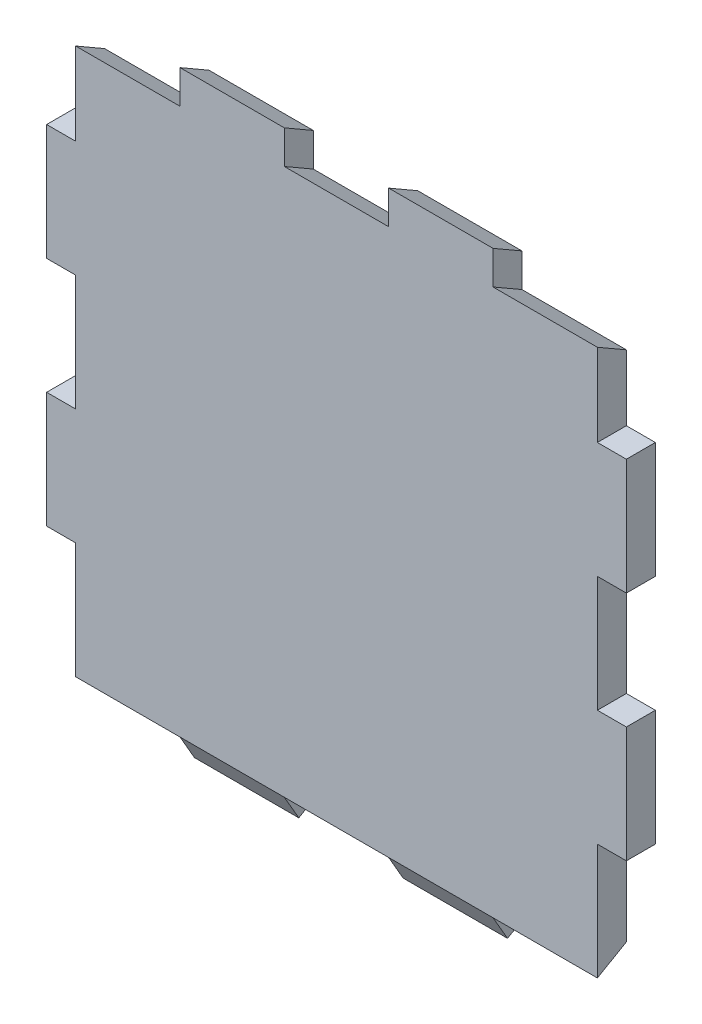
ISO-10303-21;
HEADER;
FILE_DESCRIPTION(('STEP AP214'),'2;1');
FILE_NAME('part.step','',(''),(''),'','','');
FILE_SCHEMA(('AUTOMOTIVE_DESIGN { 1 0 10303 214 1 1 1 1 }'));
ENDSEC;
DATA;
#1=APPLICATION_CONTEXT('core data for automotive mechanical design processes');
#2=APPLICATION_PROTOCOL_DEFINITION('international standard','automotive_design',2000,#1);
#3=PRODUCT_CONTEXT('',#1,'mechanical');
#4=PRODUCT('Part','Part','',(#3));
#5=PRODUCT_RELATED_PRODUCT_CATEGORY('part','',(#4));
#6=PRODUCT_DEFINITION_FORMATION('','',#4);
#7=PRODUCT_DEFINITION_CONTEXT('part definition',#1,'design');
#8=PRODUCT_DEFINITION('design','',#6,#7);
#9=PRODUCT_DEFINITION_SHAPE('','',#8);
#10=(LENGTH_UNIT() NAMED_UNIT(*) SI_UNIT(.MILLI.,.METRE.));
#11=(NAMED_UNIT(*) PLANE_ANGLE_UNIT() SI_UNIT($,.RADIAN.));
#12=(NAMED_UNIT(*) SI_UNIT($,.STERADIAN.) SOLID_ANGLE_UNIT());
#13=UNCERTAINTY_MEASURE_WITH_UNIT(LENGTH_MEASURE(1.E-05),#10,'distance_accuracy_value','');
#14=(GEOMETRIC_REPRESENTATION_CONTEXT(3) GLOBAL_UNCERTAINTY_ASSIGNED_CONTEXT((#13)) GLOBAL_UNIT_ASSIGNED_CONTEXT((#10,
#11,#12)) REPRESENTATION_CONTEXT('',''));
#15=CARTESIAN_POINT('',(0.,0.,0.));
#16=DIRECTION('',(0.,0.,1.));
#17=DIRECTION('',(1.,0.,0.));
#18=AXIS2_PLACEMENT_3D('',#15,#16,#17);
#19=CARTESIAN_POINT('',(-90.,0.,5.));
#20=DIRECTION('',(1.,0.,0.));
#21=DIRECTION('',(0.,0.,-1.));
#22=AXIS2_PLACEMENT_3D('',#19,#20,#21);
#23=PLANE('',#22);
#24=DIRECTION('',(0.,-1.,0.));
#25=VECTOR('',#24,1.);
#26=CARTESIAN_POINT('',(-90.,0.,0.));
#27=LINE('',#26,#25);
#28=CARTESIAN_POINT('',(-90.,-11.5470053838162,0.));
#29=VERTEX_POINT('',#28);
#30=CARTESIAN_POINT('',(-90.,-22.8867513459481,0.));
#31=VERTEX_POINT('',#30);
#32=EDGE_CURVE('E492',#29,#31,#27,.T.);
#33=ORIENTED_EDGE('',*,*,#32,.T.);
#34=DIRECTION('',(0.,0.,1.));
#35=VECTOR('',#34,1.);
#36=CARTESIAN_POINT('',(-90.,-22.8867513459481,0.));
#37=LINE('',#36,#35);
#38=CARTESIAN_POINT('',(-90.,-22.8867513459481,5.));
#39=VERTEX_POINT('',#38);
#40=EDGE_CURVE('E290',#31,#39,#37,.T.);
#41=ORIENTED_EDGE('',*,*,#40,.T.);
#42=DIRECTION('',(0.,-1.,0.));
#43=VECTOR('',#42,1.);
#44=CARTESIAN_POINT('',(-90.,0.,5.));
#45=LINE('',#44,#43);
#46=CARTESIAN_POINT('',(-90.,-8.66025403786807,5.00000000000001));
#47=VERTEX_POINT('',#46);
#48=EDGE_CURVE('E483',#47,#39,#45,.T.);
#49=ORIENTED_EDGE('',*,*,#48,.F.);
#50=DIRECTION('',(0.,-0.500000000000001,-0.866025403784438));
#51=VECTOR('',#50,1.);
#52=CARTESIAN_POINT('',(-90.,-11.5470053838162,0.));
#53=LINE('',#52,#51);
#54=EDGE_CURVE('E461',#47,#29,#53,.T.);
#55=ORIENTED_EDGE('',*,*,#54,.T.);
#56=EDGE_LOOP('',(#33,#41,#49,#55));
#57=FACE_BOUND('',#56,.T.);
#58=ADVANCED_FACE('F33',(#57),#23,.F.);
#59=DIRECTION('',(0.,0.,1.));
#60=VECTOR('',#59,1.);
#61=CARTESIAN_POINT('',(-90.,-82.886751345948,0.));
#62=LINE('',#61,#60);
#63=CARTESIAN_POINT('',(-90.,-82.886751345948,0.));
#64=VERTEX_POINT('',#63);
#65=CARTESIAN_POINT('',(-90.,-82.886751345948,5.));
#66=VERTEX_POINT('',#65);
#67=EDGE_CURVE('E323',#64,#66,#62,.T.);
#68=ORIENTED_EDGE('',*,*,#67,.F.);
#69=CARTESIAN_POINT('',(-90.,-100.,0.));
#70=VERTEX_POINT('',#69);
#71=EDGE_CURVE('E490',#64,#70,#27,.T.);
#72=ORIENTED_EDGE('',*,*,#71,.T.);
#73=DIRECTION('',(0.,0.500000000000007,-0.866025403784435));
#74=VECTOR('',#73,1.);
#75=CARTESIAN_POINT('',(-90.,-102.886751345948,4.99999999999983));
#76=LINE('',#75,#74);
#77=CARTESIAN_POINT('',(-90.,-102.886751345948,4.99999999999983));
#78=VERTEX_POINT('',#77);
#79=EDGE_CURVE('E450',#78,#70,#76,.T.);
#80=ORIENTED_EDGE('',*,*,#79,.F.);
#81=EDGE_CURVE('E480',#66,#78,#45,.T.);
#82=ORIENTED_EDGE('',*,*,#81,.F.);
#83=EDGE_LOOP('',(#68,#72,#80,#82));
#84=FACE_BOUND('',#83,.T.);
#85=ADVANCED_FACE('F545',(#84),#23,.F.);
#86=CARTESIAN_POINT('',(0.,0.,5.));
#87=DIRECTION('',(-1.,0.,0.));
#88=DIRECTION('',(0.,0.,1.));
#89=AXIS2_PLACEMENT_3D('',#86,#87,#88);
#90=PLANE('',#89);
#91=DIRECTION('',(0.,1.,0.));
#92=VECTOR('',#91,1.);
#93=CARTESIAN_POINT('',(0.,0.,5.));
#94=LINE('',#93,#92);
#95=CARTESIAN_POINT('',(0.,-62.886751345948,5.));
#96=VERTEX_POINT('',#95);
#97=CARTESIAN_POINT('',(0.,-42.886751345948,5.));
#98=VERTEX_POINT('',#97);
#99=EDGE_CURVE('E481',#96,#98,#94,.T.);
#100=ORIENTED_EDGE('',*,*,#99,.F.);
#101=DIRECTION('',(0.,0.,1.));
#102=VECTOR('',#101,1.);
#103=CARTESIAN_POINT('',(0.,-62.886751345948,0.));
#104=LINE('',#103,#102);
#105=CARTESIAN_POINT('',(0.,-62.886751345948,0.));
#106=VERTEX_POINT('',#105);
#107=EDGE_CURVE('E344',#106,#96,#104,.T.);
#108=ORIENTED_EDGE('',*,*,#107,.F.);
#109=DIRECTION('',(0.,1.,0.));
#110=VECTOR('',#109,1.);
#111=CARTESIAN_POINT('',(0.,0.,0.));
#112=LINE('',#111,#110);
#113=CARTESIAN_POINT('',(0.,-42.886751345948,0.));
#114=VERTEX_POINT('',#113);
#115=EDGE_CURVE('E491',#106,#114,#112,.T.);
#116=ORIENTED_EDGE('',*,*,#115,.T.);
#117=DIRECTION('',(0.,0.,1.));
#118=VECTOR('',#117,1.);
#119=CARTESIAN_POINT('',(0.,-42.886751345948,0.));
#120=LINE('',#119,#118);
#121=EDGE_CURVE('E363',#114,#98,#120,.T.);
#122=ORIENTED_EDGE('',*,*,#121,.T.);
#123=EDGE_LOOP('',(#100,#108,#116,#122));
#124=FACE_BOUND('',#123,.T.);
#125=ADVANCED_FACE('F579',(#124),#90,.F.);
#126=DIRECTION('',(0.,0.,1.));
#127=VECTOR('',#126,1.);
#128=CARTESIAN_POINT('',(0.,-22.886751345948,0.));
#129=LINE('',#128,#127);
#130=CARTESIAN_POINT('',(0.,-22.886751345948,0.));
#131=VERTEX_POINT('',#130);
#132=CARTESIAN_POINT('',(0.,-22.886751345948,5.));
#133=VERTEX_POINT('',#132);
#134=EDGE_CURVE('E371',#131,#133,#129,.T.);
#135=ORIENTED_EDGE('',*,*,#134,.F.);
#136=CARTESIAN_POINT('',(0.,-11.5470053838162,0.));
#137=VERTEX_POINT('',#136);
#138=EDGE_CURVE('E470',#131,#137,#112,.T.);
#139=ORIENTED_EDGE('',*,*,#138,.T.);
#140=DIRECTION('',(0.,-0.500000000000001,-0.866025403784438));
#141=VECTOR('',#140,1.);
#142=CARTESIAN_POINT('',(0.,-11.5470053838162,0.));
#143=LINE('',#142,#141);
#144=CARTESIAN_POINT('',(0.,-8.66025403786807,5.00000000000001));
#145=VERTEX_POINT('',#144);
#146=EDGE_CURVE('E459',#145,#137,#143,.T.);
#147=ORIENTED_EDGE('',*,*,#146,.F.);
#148=EDGE_CURVE('E482',#133,#145,#94,.T.);
#149=ORIENTED_EDGE('',*,*,#148,.F.);
#150=EDGE_LOOP('',(#135,#139,#147,#149));
#151=FACE_BOUND('',#150,.T.);
#152=ADVANCED_FACE('F593',(#151),#90,.F.);
#153=CARTESIAN_POINT('',(0.,0.,5.));
#154=DIRECTION('',(0.,0.,-1.));
#155=DIRECTION('',(-1.,0.,0.));
#156=AXIS2_PLACEMENT_3D('',#153,#154,#155);
#157=PLANE('',#156);
#158=DIRECTION('',(1.,0.,0.));
#159=VECTOR('',#158,1.);
#160=CARTESIAN_POINT('',(-90.0000000000001,-102.886751345948,5.));
#161=LINE('',#160,#159);
#162=CARTESIAN_POINT('',(-36.,-102.886751345948,4.99999999999983));
#163=VERTEX_POINT('',#162);
#164=CARTESIAN_POINT('',(-18.,-102.886751345948,5.));
#165=VERTEX_POINT('',#164);
#166=EDGE_CURVE('E390',#163,#165,#161,.T.);
#167=ORIENTED_EDGE('',*,*,#166,.T.);
#168=DIRECTION('',(1.,0.,0.));
#169=VECTOR('',#168,1.);
#170=CARTESIAN_POINT('',(-90.,-102.886751345948,4.99999999999983));
#171=LINE('',#170,#169);
#172=CARTESIAN_POINT('',(0.,-102.886751345948,4.99999999999983));
#173=VERTEX_POINT('',#172);
#174=EDGE_CURVE('E453',#165,#173,#171,.T.);
#175=ORIENTED_EDGE('',*,*,#174,.T.);
#176=CARTESIAN_POINT('',(0.,-82.886751345948,5.));
#177=VERTEX_POINT('',#176);
#178=EDGE_CURVE('E477',#173,#177,#94,.T.);
#179=ORIENTED_EDGE('',*,*,#178,.T.);
#180=DIRECTION('',(1.,0.,0.));
#181=VECTOR('',#180,1.);
#182=CARTESIAN_POINT('',(0.,-82.886751345948,5.));
#183=LINE('',#182,#181);
#184=CARTESIAN_POINT('',(5.,-82.886751345948,5.));
#185=VERTEX_POINT('',#184);
#186=EDGE_CURVE('E322',#177,#185,#183,.T.);
#187=ORIENTED_EDGE('',*,*,#186,.T.);
#188=DIRECTION('',(0.,1.,0.));
#189=VECTOR('',#188,1.);
#190=CARTESIAN_POINT('',(5.,-62.886751345948,5.));
#191=LINE('',#190,#189);
#192=CARTESIAN_POINT('',(5.,-62.886751345948,5.));
#193=VERTEX_POINT('',#192);
#194=EDGE_CURVE('E340',#185,#193,#191,.T.);
#195=ORIENTED_EDGE('',*,*,#194,.T.);
#196=DIRECTION('',(-1.,0.,0.));
#197=VECTOR('',#196,1.);
#198=CARTESIAN_POINT('',(0.,-62.886751345948,5.));
#199=LINE('',#198,#197);
#200=EDGE_CURVE('E332',#193,#96,#199,.T.);
#201=ORIENTED_EDGE('',*,*,#200,.T.);
#202=ORIENTED_EDGE('',*,*,#99,.T.);
#203=DIRECTION('',(1.,0.,0.));
#204=VECTOR('',#203,1.);
#205=CARTESIAN_POINT('',(0.,-42.886751345948,5.));
#206=LINE('',#205,#204);
#207=CARTESIAN_POINT('',(5.,-42.886751345948,5.));
#208=VERTEX_POINT('',#207);
#209=EDGE_CURVE('E347',#98,#208,#206,.T.);
#210=ORIENTED_EDGE('',*,*,#209,.T.);
#211=DIRECTION('',(0.,1.,0.));
#212=VECTOR('',#211,1.);
#213=CARTESIAN_POINT('',(5.,-22.8867513459481,5.));
#214=LINE('',#213,#212);
#215=CARTESIAN_POINT('',(5.,-22.8867513459481,5.));
#216=VERTEX_POINT('',#215);
#217=EDGE_CURVE('E366',#208,#216,#214,.T.);
#218=ORIENTED_EDGE('',*,*,#217,.T.);
#219=DIRECTION('',(-1.,0.,0.));
#220=VECTOR('',#219,1.);
#221=CARTESIAN_POINT('',(0.,-22.886751345948,5.));
#222=LINE('',#221,#220);
#223=EDGE_CURVE('E358',#216,#133,#222,.T.);
#224=ORIENTED_EDGE('',*,*,#223,.T.);
#225=ORIENTED_EDGE('',*,*,#148,.T.);
#226=DIRECTION('',(1.,0.,0.));
#227=VECTOR('',#226,1.);
#228=CARTESIAN_POINT('',(-90.,-8.66025403786807,5.00000000000001));
#229=LINE('',#228,#227);
#230=CARTESIAN_POINT('',(-18.,-8.66025403786807,5.00000000000001));
#231=VERTEX_POINT('',#230);
#232=EDGE_CURVE('E464',#231,#145,#229,.T.);
#233=ORIENTED_EDGE('',*,*,#232,.F.);
#234=DIRECTION('',(0.,-1.,0.));
#235=VECTOR('',#234,1.);
#236=CARTESIAN_POINT('',(-18.,3.4529946161838,5.00000000000001));
#237=LINE('',#236,#235);
#238=CARTESIAN_POINT('',(-18.,-2.88675134594796,5.00000000000001));
#239=VERTEX_POINT('',#238);
#240=EDGE_CURVE('E440',#239,#231,#237,.T.);
#241=ORIENTED_EDGE('',*,*,#240,.F.);
#242=DIRECTION('',(1.,0.,0.));
#243=VECTOR('',#242,1.);
#244=CARTESIAN_POINT('',(-90.,-2.88675134594796,5.00000000000001));
#245=LINE('',#244,#243);
#246=CARTESIAN_POINT('',(-36.,-2.88675134594796,5.00000000000001));
#247=VERTEX_POINT('',#246);
#248=EDGE_CURVE('E418',#247,#239,#245,.T.);
#249=ORIENTED_EDGE('',*,*,#248,.F.);
#250=DIRECTION('',(0.,1.,0.));
#251=VECTOR('',#250,1.);
#252=CARTESIAN_POINT('',(-36.,3.45299461618379,5.00000000000001));
#253=LINE('',#252,#251);
#254=CARTESIAN_POINT('',(-36.,-8.66025403786807,5.00000000000001));
#255=VERTEX_POINT('',#254);
#256=EDGE_CURVE('E442',#255,#247,#253,.T.);
#257=ORIENTED_EDGE('',*,*,#256,.F.);
#258=CARTESIAN_POINT('',(-54.,-8.66025403786807,5.00000000000001));
#259=VERTEX_POINT('',#258);
#260=EDGE_CURVE('E476',#259,#255,#229,.T.);
#261=ORIENTED_EDGE('',*,*,#260,.F.);
#262=DIRECTION('',(0.,-1.,0.));
#263=VECTOR('',#262,1.);
#264=CARTESIAN_POINT('',(-54.,3.4529946161838,5.00000000000001));
#265=LINE('',#264,#263);
#266=CARTESIAN_POINT('',(-54.,-2.88675134594796,5.00000000000001));
#267=VERTEX_POINT('',#266);
#268=EDGE_CURVE('E430',#267,#259,#265,.T.);
#269=ORIENTED_EDGE('',*,*,#268,.F.);
#270=CARTESIAN_POINT('',(-72.,-2.88675134594796,5.00000000000001));
#271=VERTEX_POINT('',#270);
#272=EDGE_CURVE('E423',#271,#267,#245,.T.);
#273=ORIENTED_EDGE('',*,*,#272,.F.);
#274=DIRECTION('',(0.,1.,0.));
#275=VECTOR('',#274,1.);
#276=CARTESIAN_POINT('',(-72.,3.4529946161838,5.00000000000001));
#277=LINE('',#276,#275);
#278=CARTESIAN_POINT('',(-72.,-8.66025403786807,5.00000000000001));
#279=VERTEX_POINT('',#278);
#280=EDGE_CURVE('E432',#279,#271,#277,.T.);
#281=ORIENTED_EDGE('',*,*,#280,.F.);
#282=EDGE_CURVE('E473',#47,#279,#229,.T.);
#283=ORIENTED_EDGE('',*,*,#282,.F.);
#284=ORIENTED_EDGE('',*,*,#48,.T.);
#285=DIRECTION('',(-1.,0.,0.));
#286=VECTOR('',#285,1.);
#287=CARTESIAN_POINT('',(-90.,-22.8867513459481,5.));
#288=LINE('',#287,#286);
#289=CARTESIAN_POINT('',(-95.,-22.8867513459481,5.));
#290=VERTEX_POINT('',#289);
#291=EDGE_CURVE('E295',#39,#290,#288,.T.);
#292=ORIENTED_EDGE('',*,*,#291,.T.);
#293=DIRECTION('',(0.,-1.,0.));
#294=VECTOR('',#293,1.);
#295=CARTESIAN_POINT('',(-95.,-22.8867513459481,5.));
#296=LINE('',#295,#294);
#297=CARTESIAN_POINT('',(-95.,-42.8867513459481,5.));
#298=VERTEX_POINT('',#297);
#299=EDGE_CURVE('E271',#290,#298,#296,.T.);
#300=ORIENTED_EDGE('',*,*,#299,.T.);
#301=DIRECTION('',(1.,0.,0.));
#302=VECTOR('',#301,1.);
#303=CARTESIAN_POINT('',(-90.,-42.8867513459481,5.));
#304=LINE('',#303,#302);
#305=CARTESIAN_POINT('',(-90.,-42.8867513459481,5.));
#306=VERTEX_POINT('',#305);
#307=EDGE_CURVE('E48',#298,#306,#304,.T.);
#308=ORIENTED_EDGE('',*,*,#307,.T.);
#309=CARTESIAN_POINT('',(-90.,-62.886751345948,5.));
#310=VERTEX_POINT('',#309);
#311=EDGE_CURVE('E53',#306,#310,#45,.T.);
#312=ORIENTED_EDGE('',*,*,#311,.T.);
#313=DIRECTION('',(-1.,0.,0.));
#314=VECTOR('',#313,1.);
#315=CARTESIAN_POINT('',(-90.,-62.886751345948,5.));
#316=LINE('',#315,#314);
#317=CARTESIAN_POINT('',(-95.,-62.886751345948,5.));
#318=VERTEX_POINT('',#317);
#319=EDGE_CURVE('E299',#310,#318,#316,.T.);
#320=ORIENTED_EDGE('',*,*,#319,.T.);
#321=DIRECTION('',(0.,-1.,0.));
#322=VECTOR('',#321,1.);
#323=CARTESIAN_POINT('',(-95.,-62.886751345948,5.));
#324=LINE('',#323,#322);
#325=CARTESIAN_POINT('',(-95.,-82.886751345948,5.));
#326=VERTEX_POINT('',#325);
#327=EDGE_CURVE('E314',#318,#326,#324,.T.);
#328=ORIENTED_EDGE('',*,*,#327,.T.);
#329=DIRECTION('',(1.,0.,0.));
#330=VECTOR('',#329,1.);
#331=CARTESIAN_POINT('',(-90.,-82.886751345948,5.));
#332=LINE('',#331,#330);
#333=EDGE_CURVE('E307',#326,#66,#332,.T.);
#334=ORIENTED_EDGE('',*,*,#333,.T.);
#335=ORIENTED_EDGE('',*,*,#81,.T.);
#336=CARTESIAN_POINT('',(-72.,-102.886751345948,4.99999999999983));
#337=VERTEX_POINT('',#336);
#338=EDGE_CURVE('E456',#78,#337,#171,.T.);
#339=ORIENTED_EDGE('',*,*,#338,.T.);
#340=CARTESIAN_POINT('',(-54.,-102.886751345948,5.));
#341=VERTEX_POINT('',#340);
#342=EDGE_CURVE('E389',#337,#341,#161,.T.);
#343=ORIENTED_EDGE('',*,*,#342,.T.);
#344=EDGE_CURVE('E460',#341,#163,#171,.T.);
#345=ORIENTED_EDGE('',*,*,#344,.T.);
#346=EDGE_LOOP('',(#167,#175,#179,#187,#195,#201,#202,#210,#218,#224,#225,#233,#241,#249,#257,
#261,#269,#273,#281,#283,#284,#292,#300,#308,#312,#320,#328,#334,#335,#339,#343,#345));
#347=FACE_BOUND('',#346,.T.);
#348=ADVANCED_FACE('F538',(#347),#157,.F.);
#349=CARTESIAN_POINT('',(0.,0.,0.));
#350=DIRECTION('',(0.,0.,-1.));
#351=DIRECTION('',(-1.,0.,0.));
#352=AXIS2_PLACEMENT_3D('',#349,#350,#351);
#353=PLANE('',#352);
#354=DIRECTION('',(0.,-1.,0.));
#355=VECTOR('',#354,1.);
#356=CARTESIAN_POINT('',(-18.,-100.,0.));
#357=LINE('',#356,#355);
#358=CARTESIAN_POINT('',(-18.,-100.,0.));
#359=VERTEX_POINT('',#358);
#360=CARTESIAN_POINT('',(-18.,-105.773502691896,0.));
#361=VERTEX_POINT('',#360);
#362=EDGE_CURVE('E412',#359,#361,#357,.T.);
#363=ORIENTED_EDGE('',*,*,#362,.T.);
#364=DIRECTION('',(1.,0.,0.));
#365=VECTOR('',#364,1.);
#366=CARTESIAN_POINT('',(-90.0000000000001,-105.773502691896,0.));
#367=LINE('',#366,#365);
#368=CARTESIAN_POINT('',(-36.,-105.773502691896,0.));
#369=VERTEX_POINT('',#368);
#370=EDGE_CURVE('E386',#369,#361,#367,.T.);
#371=ORIENTED_EDGE('',*,*,#370,.F.);
#372=DIRECTION('',(0.,1.,0.));
#373=VECTOR('',#372,1.);
#374=CARTESIAN_POINT('',(-36.,-100.,0.));
#375=LINE('',#374,#373);
#376=CARTESIAN_POINT('',(-36.,-100.,0.));
#377=VERTEX_POINT('',#376);
#378=EDGE_CURVE('E414',#369,#377,#375,.T.);
#379=ORIENTED_EDGE('',*,*,#378,.T.);
#380=DIRECTION('',(1.,0.,0.));
#381=VECTOR('',#380,1.);
#382=CARTESIAN_POINT('',(0.,-100.,0.));
#383=LINE('',#382,#381);
#384=CARTESIAN_POINT('',(-54.,-100.,0.));
#385=VERTEX_POINT('',#384);
#386=EDGE_CURVE('E499',#385,#377,#383,.T.);
#387=ORIENTED_EDGE('',*,*,#386,.F.);
#388=DIRECTION('',(0.,-1.,0.));
#389=VECTOR('',#388,1.);
#390=CARTESIAN_POINT('',(-54.,-100.,0.));
#391=LINE('',#390,#389);
#392=CARTESIAN_POINT('',(-54.,-105.773502691896,0.));
#393=VERTEX_POINT('',#392);
#394=EDGE_CURVE('E407',#385,#393,#391,.T.);
#395=ORIENTED_EDGE('',*,*,#394,.T.);
#396=CARTESIAN_POINT('',(-72.,-105.773502691896,0.));
#397=VERTEX_POINT('',#396);
#398=EDGE_CURVE('E388',#397,#393,#367,.T.);
#399=ORIENTED_EDGE('',*,*,#398,.F.);
#400=DIRECTION('',(0.,1.,0.));
#401=VECTOR('',#400,1.);
#402=CARTESIAN_POINT('',(-72.,-100.,0.));
#403=LINE('',#402,#401);
#404=CARTESIAN_POINT('',(-72.,-100.,0.));
#405=VERTEX_POINT('',#404);
#406=EDGE_CURVE('E410',#397,#405,#403,.T.);
#407=ORIENTED_EDGE('',*,*,#406,.T.);
#408=EDGE_CURVE('E496',#70,#405,#383,.T.);
#409=ORIENTED_EDGE('',*,*,#408,.F.);
#410=ORIENTED_EDGE('',*,*,#71,.F.);
#411=DIRECTION('',(1.,0.,0.));
#412=VECTOR('',#411,1.);
#413=CARTESIAN_POINT('',(-90.,-82.886751345948,0.));
#414=LINE('',#413,#412);
#415=CARTESIAN_POINT('',(-95.,-82.886751345948,0.));
#416=VERTEX_POINT('',#415);
#417=EDGE_CURVE('E310',#416,#64,#414,.T.);
#418=ORIENTED_EDGE('',*,*,#417,.F.);
#419=DIRECTION('',(0.,-1.,0.));
#420=VECTOR('',#419,1.);
#421=CARTESIAN_POINT('',(-95.,-62.886751345948,0.));
#422=LINE('',#421,#420);
#423=CARTESIAN_POINT('',(-95.,-62.886751345948,0.));
#424=VERTEX_POINT('',#423);
#425=EDGE_CURVE('E306',#424,#416,#422,.T.);
#426=ORIENTED_EDGE('',*,*,#425,.F.);
#427=DIRECTION('',(-1.,0.,0.));
#428=VECTOR('',#427,1.);
#429=CARTESIAN_POINT('',(-90.,-62.886751345948,0.));
#430=LINE('',#429,#428);
#431=CARTESIAN_POINT('',(-90.,-62.886751345948,0.));
#432=VERTEX_POINT('',#431);
#433=EDGE_CURVE('E303',#432,#424,#430,.T.);
#434=ORIENTED_EDGE('',*,*,#433,.F.);
#435=CARTESIAN_POINT('',(-90.,-42.8867513459481,0.));
#436=VERTEX_POINT('',#435);
#437=EDGE_CURVE('E495',#436,#432,#27,.T.);
#438=ORIENTED_EDGE('',*,*,#437,.F.);
#439=DIRECTION('',(1.,0.,0.));
#440=VECTOR('',#439,1.);
#441=CARTESIAN_POINT('',(-90.,-42.8867513459481,0.));
#442=LINE('',#441,#440);
#443=CARTESIAN_POINT('',(-95.,-42.8867513459481,0.));
#444=VERTEX_POINT('',#443);
#445=EDGE_CURVE('E276',#444,#436,#442,.T.);
#446=ORIENTED_EDGE('',*,*,#445,.F.);
#447=DIRECTION('',(0.,-1.,0.));
#448=VECTOR('',#447,1.);
#449=CARTESIAN_POINT('',(-95.,-22.8867513459481,0.));
#450=LINE('',#449,#448);
#451=CARTESIAN_POINT('',(-95.,-22.8867513459481,0.));
#452=VERTEX_POINT('',#451);
#453=EDGE_CURVE('E270',#452,#444,#450,.T.);
#454=ORIENTED_EDGE('',*,*,#453,.F.);
#455=DIRECTION('',(-1.,0.,0.));
#456=VECTOR('',#455,1.);
#457=CARTESIAN_POINT('',(-90.,-22.8867513459481,0.));
#458=LINE('',#457,#456);
#459=EDGE_CURVE('E284',#31,#452,#458,.T.);
#460=ORIENTED_EDGE('',*,*,#459,.F.);
#461=ORIENTED_EDGE('',*,*,#32,.F.);
#462=DIRECTION('',(1.,0.,0.));
#463=VECTOR('',#462,1.);
#464=CARTESIAN_POINT('',(-90.,-11.5470053838162,0.));
#465=LINE('',#464,#463);
#466=CARTESIAN_POINT('',(-72.,-11.5470053838162,0.));
#467=VERTEX_POINT('',#466);
#468=EDGE_CURVE('E467',#29,#467,#465,.T.);
#469=ORIENTED_EDGE('',*,*,#468,.T.);
#470=DIRECTION('',(0.,1.,0.));
#471=VECTOR('',#470,1.);
#472=CARTESIAN_POINT('',(-72.,3.4529946161838,0.));
#473=LINE('',#472,#471);
#474=CARTESIAN_POINT('',(-72.,-5.77350269189609,0.));
#475=VERTEX_POINT('',#474);
#476=EDGE_CURVE('E433',#467,#475,#473,.T.);
#477=ORIENTED_EDGE('',*,*,#476,.T.);
#478=DIRECTION('',(1.,0.,0.));
#479=VECTOR('',#478,1.);
#480=CARTESIAN_POINT('',(-90.,-5.77350269189609,0.));
#481=LINE('',#480,#479);
#482=CARTESIAN_POINT('',(-54.,-5.77350269189609,0.));
#483=VERTEX_POINT('',#482);
#484=EDGE_CURVE('E422',#475,#483,#481,.T.);
#485=ORIENTED_EDGE('',*,*,#484,.T.);
#486=DIRECTION('',(0.,-1.,0.));
#487=VECTOR('',#486,1.);
#488=CARTESIAN_POINT('',(-54.,3.4529946161838,0.));
#489=LINE('',#488,#487);
#490=CARTESIAN_POINT('',(-54.,-11.5470053838162,0.));
#491=VERTEX_POINT('',#490);
#492=EDGE_CURVE('E429',#483,#491,#489,.T.);
#493=ORIENTED_EDGE('',*,*,#492,.T.);
#494=CARTESIAN_POINT('',(-36.,-11.5470053838162,0.));
#495=VERTEX_POINT('',#494);
#496=EDGE_CURVE('E471',#491,#495,#465,.T.);
#497=ORIENTED_EDGE('',*,*,#496,.T.);
#498=DIRECTION('',(0.,1.,0.));
#499=VECTOR('',#498,1.);
#500=CARTESIAN_POINT('',(-36.,3.45299461618379,0.));
#501=LINE('',#500,#499);
#502=CARTESIAN_POINT('',(-36.,-5.77350269189609,0.));
#503=VERTEX_POINT('',#502);
#504=EDGE_CURVE('E443',#495,#503,#501,.T.);
#505=ORIENTED_EDGE('',*,*,#504,.T.);
#506=CARTESIAN_POINT('',(-18.,-5.77350269189609,0.));
#507=VERTEX_POINT('',#506);
#508=EDGE_CURVE('E419',#503,#507,#481,.T.);
#509=ORIENTED_EDGE('',*,*,#508,.T.);
#510=DIRECTION('',(0.,-1.,0.));
#511=VECTOR('',#510,1.);
#512=CARTESIAN_POINT('',(-18.,3.4529946161838,0.));
#513=LINE('',#512,#511);
#514=CARTESIAN_POINT('',(-18.,-11.5470053838162,0.));
#515=VERTEX_POINT('',#514);
#516=EDGE_CURVE('E436',#507,#515,#513,.T.);
#517=ORIENTED_EDGE('',*,*,#516,.T.);
#518=EDGE_CURVE('E472',#515,#137,#465,.T.);
#519=ORIENTED_EDGE('',*,*,#518,.T.);
#520=ORIENTED_EDGE('',*,*,#138,.F.);
#521=DIRECTION('',(-1.,0.,0.));
#522=VECTOR('',#521,1.);
#523=CARTESIAN_POINT('',(0.,-22.886751345948,0.));
#524=LINE('',#523,#522);
#525=CARTESIAN_POINT('',(5.,-22.8867513459481,0.));
#526=VERTEX_POINT('',#525);
#527=EDGE_CURVE('E361',#526,#131,#524,.T.);
#528=ORIENTED_EDGE('',*,*,#527,.F.);
#529=DIRECTION('',(0.,1.,0.));
#530=VECTOR('',#529,1.);
#531=CARTESIAN_POINT('',(5.,-22.8867513459481,0.));
#532=LINE('',#531,#530);
#533=CARTESIAN_POINT('',(5.,-42.886751345948,0.));
#534=VERTEX_POINT('',#533);
#535=EDGE_CURVE('E357',#534,#526,#532,.T.);
#536=ORIENTED_EDGE('',*,*,#535,.F.);
#537=DIRECTION('',(1.,0.,0.));
#538=VECTOR('',#537,1.);
#539=CARTESIAN_POINT('',(0.,-42.886751345948,0.));
#540=LINE('',#539,#538);
#541=EDGE_CURVE('E354',#114,#534,#540,.T.);
#542=ORIENTED_EDGE('',*,*,#541,.F.);
#543=ORIENTED_EDGE('',*,*,#115,.F.);
#544=DIRECTION('',(-1.,0.,0.));
#545=VECTOR('',#544,1.);
#546=CARTESIAN_POINT('',(0.,-62.886751345948,0.));
#547=LINE('',#546,#545);
#548=CARTESIAN_POINT('',(5.,-62.886751345948,0.));
#549=VERTEX_POINT('',#548);
#550=EDGE_CURVE('E335',#549,#106,#547,.T.);
#551=ORIENTED_EDGE('',*,*,#550,.F.);
#552=DIRECTION('',(0.,1.,0.));
#553=VECTOR('',#552,1.);
#554=CARTESIAN_POINT('',(5.,-62.886751345948,0.));
#555=LINE('',#554,#553);
#556=CARTESIAN_POINT('',(5.,-82.886751345948,0.));
#557=VERTEX_POINT('',#556);
#558=EDGE_CURVE('E331',#557,#549,#555,.T.);
#559=ORIENTED_EDGE('',*,*,#558,.F.);
#560=DIRECTION('',(1.,0.,0.));
#561=VECTOR('',#560,1.);
#562=CARTESIAN_POINT('',(0.,-82.886751345948,0.));
#563=LINE('',#562,#561);
#564=CARTESIAN_POINT('',(0.,-82.886751345948,0.));
#565=VERTEX_POINT('',#564);
#566=EDGE_CURVE('E328',#565,#557,#563,.T.);
#567=ORIENTED_EDGE('',*,*,#566,.F.);
#568=CARTESIAN_POINT('',(0.,-100.,0.));
#569=VERTEX_POINT('',#568);
#570=EDGE_CURVE('E487',#569,#565,#112,.T.);
#571=ORIENTED_EDGE('',*,*,#570,.F.);
#572=EDGE_CURVE('E494',#359,#569,#383,.T.);
#573=ORIENTED_EDGE('',*,*,#572,.F.);
#574=EDGE_LOOP('',(#363,#371,#379,#387,#395,#399,#407,#409,#410,#418,#426,#434,#438,#446,#454,
#460,#461,#469,#477,#485,#493,#497,#505,#509,#517,#519,#520,#528,#536,#542,#543,#551,#559,#567,
#571,#573));
#575=FACE_BOUND('',#574,.T.);
#576=ADVANCED_FACE('F282',(#575),#353,.T.);
#577=CARTESIAN_POINT('',(-18.,-100.,5.));
#578=DIRECTION('',(1.,0.,0.));
#579=DIRECTION('',(0.,1.,0.));
#580=AXIS2_PLACEMENT_3D('',#577,#578,#579);
#581=PLANE('',#580);
#582=DIRECTION('',(0.,-0.866025403784437,-0.500000000000002));
#583=VECTOR('',#582,1.);
#584=CARTESIAN_POINT('',(-17.9999999999999,-27.8867513459483,48.3012701892219));
#585=LINE('',#584,#583);
#586=CARTESIAN_POINT('',(-18.,-107.21687836487,2.50000000000001));
#587=VERTEX_POINT('',#586);
#588=EDGE_CURVE('E382',#165,#587,#585,.T.);
#589=ORIENTED_EDGE('',*,*,#588,.T.);
#590=DIRECTION('',(0.,0.500000000000001,-0.866025403784438));
#591=VECTOR('',#590,1.);
#592=CARTESIAN_POINT('',(-18.,-79.3301270189218,-45.8012701892219));
#593=LINE('',#592,#591);
#594=EDGE_CURVE('E373',#587,#361,#593,.T.);
#595=ORIENTED_EDGE('',*,*,#594,.T.);
#596=ORIENTED_EDGE('',*,*,#362,.F.);
#597=DIRECTION('',(0.,-0.500000000000007,0.866025403784435));
#598=VECTOR('',#597,1.);
#599=CARTESIAN_POINT('',(-18.,-102.886751345948,4.99999999999985));
#600=LINE('',#599,#598);
#601=EDGE_CURVE('E516',#359,#165,#600,.T.);
#602=ORIENTED_EDGE('',*,*,#601,.T.);
#603=EDGE_LOOP('',(#589,#595,#596,#602));
#604=FACE_BOUND('',#603,.T.);
#605=ADVANCED_FACE('F692',(#604),#581,.T.);
#606=CARTESIAN_POINT('',(-36.,-100.,5.));
#607=DIRECTION('',(-1.,0.,0.));
#608=DIRECTION('',(0.,0.,1.));
#609=AXIS2_PLACEMENT_3D('',#606,#607,#608);
#610=PLANE('',#609);
#611=ORIENTED_EDGE('',*,*,#378,.F.);
#612=DIRECTION('',(0.,-0.500000000000001,0.866025403784438));
#613=VECTOR('',#612,1.);
#614=CARTESIAN_POINT('',(-36.,-106.495190528383,1.25000000000015));
#615=LINE('',#614,#613);
#616=CARTESIAN_POINT('',(-36.,-107.21687836487,2.50000000000001));
#617=VERTEX_POINT('',#616);
#618=EDGE_CURVE('E404',#369,#617,#615,.T.);
#619=ORIENTED_EDGE('',*,*,#618,.T.);
#620=DIRECTION('',(0.,0.866025403784437,0.500000000000002));
#621=VECTOR('',#620,1.);
#622=CARTESIAN_POINT('',(-36.,-100.721687836487,6.24999999999986));
#623=LINE('',#622,#621);
#624=EDGE_CURVE('E398',#617,#163,#623,.T.);
#625=ORIENTED_EDGE('',*,*,#624,.T.);
#626=DIRECTION('',(0.,0.500000000000007,-0.866025403784435));
#627=VECTOR('',#626,1.);
#628=CARTESIAN_POINT('',(-36.,-102.886751345948,4.99999999999983));
#629=LINE('',#628,#627);
#630=EDGE_CURVE('E513',#163,#377,#629,.T.);
#631=ORIENTED_EDGE('',*,*,#630,.T.);
#632=EDGE_LOOP('',(#611,#619,#625,#631));
#633=FACE_BOUND('',#632,.T.);
#634=ADVANCED_FACE('F696',(#633),#610,.T.);
#635=CARTESIAN_POINT('',(-54.,-100.,5.));
#636=DIRECTION('',(1.,0.,0.));
#637=DIRECTION('',(0.,0.,-1.));
#638=AXIS2_PLACEMENT_3D('',#635,#636,#637);
#639=PLANE('',#638);
#640=DIRECTION('',(0.,-0.866025403784437,-0.500000000000002));
#641=VECTOR('',#640,1.);
#642=CARTESIAN_POINT('',(-54.,-100.721687836487,6.24999999999986));
#643=LINE('',#642,#641);
#644=CARTESIAN_POINT('',(-54.,-107.21687836487,2.50000000000001));
#645=VERTEX_POINT('',#644);
#646=EDGE_CURVE('E395',#341,#645,#643,.T.);
#647=ORIENTED_EDGE('',*,*,#646,.T.);
#648=DIRECTION('',(0.,0.500000000000001,-0.866025403784438));
#649=VECTOR('',#648,1.);
#650=CARTESIAN_POINT('',(-54.,-106.495190528383,1.25000000000016));
#651=LINE('',#650,#649);
#652=EDGE_CURVE('E401',#645,#393,#651,.T.);
#653=ORIENTED_EDGE('',*,*,#652,.T.);
#654=ORIENTED_EDGE('',*,*,#394,.F.);
#655=DIRECTION('',(0.,-0.500000000000007,0.866025403784435));
#656=VECTOR('',#655,1.);
#657=CARTESIAN_POINT('',(-54.,-102.886751345948,4.99999999999983));
#658=LINE('',#657,#656);
#659=EDGE_CURVE('E522',#385,#341,#658,.T.);
#660=ORIENTED_EDGE('',*,*,#659,.T.);
#661=EDGE_LOOP('',(#647,#653,#654,#660));
#662=FACE_BOUND('',#661,.T.);
#663=ADVANCED_FACE('F553',(#662),#639,.T.);
#664=CARTESIAN_POINT('',(-72.,-100.,5.));
#665=DIRECTION('',(-1.,0.,0.));
#666=DIRECTION('',(0.,-1.,0.));
#667=AXIS2_PLACEMENT_3D('',#664,#665,#666);
#668=PLANE('',#667);
#669=ORIENTED_EDGE('',*,*,#406,.F.);
#670=DIRECTION('',(0.,-0.500000000000001,0.866025403784438));
#671=VECTOR('',#670,1.);
#672=CARTESIAN_POINT('',(-72.,-106.495190528383,1.25000000000017));
#673=LINE('',#672,#671);
#674=CARTESIAN_POINT('',(-72.,-107.21687836487,2.50000000000001));
#675=VERTEX_POINT('',#674);
#676=EDGE_CURVE('E11',#397,#675,#673,.T.);
#677=ORIENTED_EDGE('',*,*,#676,.T.);
#678=DIRECTION('',(0.,0.866025403784437,0.500000000000002));
#679=VECTOR('',#678,1.);
#680=CARTESIAN_POINT('',(-72.,-100.721687836487,6.24999999999985));
#681=LINE('',#680,#679);
#682=EDGE_CURVE('E41',#675,#337,#681,.T.);
#683=ORIENTED_EDGE('',*,*,#682,.T.);
#684=DIRECTION('',(0.,0.500000000000007,-0.866025403784435));
#685=VECTOR('',#684,1.);
#686=CARTESIAN_POINT('',(-72.,-102.886751345948,4.99999999999982));
#687=LINE('',#686,#685);
#688=EDGE_CURVE('E519',#337,#405,#687,.T.);
#689=ORIENTED_EDGE('',*,*,#688,.T.);
#690=EDGE_LOOP('',(#669,#677,#683,#689));
#691=FACE_BOUND('',#690,.T.);
#692=ADVANCED_FACE('F528',(#691),#668,.T.);
#693=CARTESIAN_POINT('',(-90.,-102.886751345948,4.99999999999983));
#694=DIRECTION('',(0.,-0.866025403784435,-0.500000000000007));
#695=DIRECTION('',(0.,0.500000000000007,-0.866025403784435));
#696=AXIS2_PLACEMENT_3D('',#693,#694,#695);
#697=PLANE('',#696);
#698=ORIENTED_EDGE('',*,*,#659,.F.);
#699=ORIENTED_EDGE('',*,*,#386,.T.);
#700=ORIENTED_EDGE('',*,*,#630,.F.);
#701=ORIENTED_EDGE('',*,*,#344,.F.);
#702=EDGE_LOOP('',(#698,#699,#700,#701));
#703=FACE_BOUND('',#702,.T.);
#704=ADVANCED_FACE('F686',(#703),#697,.T.);
#705=ORIENTED_EDGE('',*,*,#601,.F.);
#706=ORIENTED_EDGE('',*,*,#572,.T.);
#707=DIRECTION('',(0.,0.500000000000007,-0.866025403784435));
#708=VECTOR('',#707,1.);
#709=CARTESIAN_POINT('',(0.,-102.886751345948,4.99999999999983));
#710=LINE('',#709,#708);
#711=EDGE_CURVE('E446',#173,#569,#710,.T.);
#712=ORIENTED_EDGE('',*,*,#711,.F.);
#713=ORIENTED_EDGE('',*,*,#174,.F.);
#714=EDGE_LOOP('',(#705,#706,#712,#713));
#715=FACE_BOUND('',#714,.T.);
#716=ADVANCED_FACE('F687',(#715),#697,.T.);
#717=CARTESIAN_POINT('',(-90.,-11.5470053838162,0.));
#718=DIRECTION('',(0.,-0.866025403784438,0.500000000000001));
#719=DIRECTION('',(0.,-0.500000000000001,-0.866025403784438));
#720=AXIS2_PLACEMENT_3D('',#717,#718,#719);
#721=PLANE('',#720);
#722=ORIENTED_EDGE('',*,*,#496,.F.);
#723=DIRECTION('',(0.,0.500000000000001,0.866025403784438));
#724=VECTOR('',#723,1.);
#725=CARTESIAN_POINT('',(-54.,-11.5470053838162,0.));
#726=LINE('',#725,#724);
#727=EDGE_CURVE('E508',#491,#259,#726,.T.);
#728=ORIENTED_EDGE('',*,*,#727,.T.);
#729=ORIENTED_EDGE('',*,*,#260,.T.);
#730=DIRECTION('',(0.,-0.500000000000001,-0.866025403784438));
#731=VECTOR('',#730,1.);
#732=CARTESIAN_POINT('',(-36.,-11.5470053838162,0.));
#733=LINE('',#732,#731);
#734=EDGE_CURVE('E486',#255,#495,#733,.T.);
#735=ORIENTED_EDGE('',*,*,#734,.T.);
#736=EDGE_LOOP('',(#722,#728,#729,#735));
#737=FACE_BOUND('',#736,.T.);
#738=ADVANCED_FACE('F590',(#737),#721,.F.);
#739=ORIENTED_EDGE('',*,*,#518,.F.);
#740=DIRECTION('',(0.,0.500000000000001,0.866025403784438));
#741=VECTOR('',#740,1.);
#742=CARTESIAN_POINT('',(-18.,-11.5470053838162,0.));
#743=LINE('',#742,#741);
#744=EDGE_CURVE('E502',#515,#231,#743,.T.);
#745=ORIENTED_EDGE('',*,*,#744,.T.);
#746=ORIENTED_EDGE('',*,*,#232,.T.);
#747=ORIENTED_EDGE('',*,*,#146,.T.);
#748=EDGE_LOOP('',(#739,#745,#746,#747));
#749=FACE_BOUND('',#748,.T.);
#750=ADVANCED_FACE('F591',(#749),#721,.F.);
#751=ORIENTED_EDGE('',*,*,#570,.T.);
#752=DIRECTION('',(0.,0.,1.));
#753=VECTOR('',#752,1.);
#754=CARTESIAN_POINT('',(0.,-82.886751345948,0.));
#755=LINE('',#754,#753);
#756=EDGE_CURVE('E337',#565,#177,#755,.T.);
#757=ORIENTED_EDGE('',*,*,#756,.T.);
#758=ORIENTED_EDGE('',*,*,#178,.F.);
#759=ORIENTED_EDGE('',*,*,#711,.T.);
#760=EDGE_LOOP('',(#751,#757,#758,#759));
#761=FACE_BOUND('',#760,.T.);
#762=ADVANCED_FACE('F35',(#761),#90,.F.);
#763=ORIENTED_EDGE('',*,*,#311,.F.);
#764=DIRECTION('',(0.,0.,1.));
#765=VECTOR('',#764,1.);
#766=CARTESIAN_POINT('',(-90.,-42.8867513459481,0.));
#767=LINE('',#766,#765);
#768=EDGE_CURVE('E300',#436,#306,#767,.T.);
#769=ORIENTED_EDGE('',*,*,#768,.F.);
#770=ORIENTED_EDGE('',*,*,#437,.T.);
#771=DIRECTION('',(0.,0.,1.));
#772=VECTOR('',#771,1.);
#773=CARTESIAN_POINT('',(-90.,-62.886751345948,0.));
#774=LINE('',#773,#772);
#775=EDGE_CURVE('E319',#432,#310,#774,.T.);
#776=ORIENTED_EDGE('',*,*,#775,.T.);
#777=EDGE_LOOP('',(#763,#769,#770,#776));
#778=FACE_BOUND('',#777,.T.);
#779=ADVANCED_FACE('F575',(#778),#23,.F.);
#780=ORIENTED_EDGE('',*,*,#282,.T.);
#781=DIRECTION('',(0.,-0.500000000000001,-0.866025403784438));
#782=VECTOR('',#781,1.);
#783=CARTESIAN_POINT('',(-72.,-11.5470053838162,0.));
#784=LINE('',#783,#782);
#785=EDGE_CURVE('E505',#279,#467,#784,.T.);
#786=ORIENTED_EDGE('',*,*,#785,.T.);
#787=ORIENTED_EDGE('',*,*,#468,.F.);
#788=ORIENTED_EDGE('',*,*,#54,.F.);
#789=EDGE_LOOP('',(#780,#786,#787,#788));
#790=FACE_BOUND('',#789,.T.);
#791=ADVANCED_FACE('F582',(#790),#721,.F.);
#792=ORIENTED_EDGE('',*,*,#688,.F.);
#793=ORIENTED_EDGE('',*,*,#338,.F.);
#794=ORIENTED_EDGE('',*,*,#79,.T.);
#795=ORIENTED_EDGE('',*,*,#408,.T.);
#796=EDGE_LOOP('',(#792,#793,#794,#795));
#797=FACE_BOUND('',#796,.T.);
#798=ADVANCED_FACE('F534',(#797),#697,.T.);
#799=CARTESIAN_POINT('',(-18.,3.4529946161838,5.00000000000001));
#800=DIRECTION('',(1.,0.,0.));
#801=DIRECTION('',(0.,0.,-1.));
#802=AXIS2_PLACEMENT_3D('',#799,#800,#801);
#803=PLANE('',#802);
#804=DIRECTION('',(0.,-0.5,-0.866025403784439));
#805=VECTOR('',#804,1.);
#806=CARTESIAN_POINT('',(-18.,-5.77350269189609,0.));
#807=LINE('',#806,#805);
#808=EDGE_CURVE('E416',#239,#507,#807,.T.);
#809=ORIENTED_EDGE('',*,*,#808,.F.);
#810=ORIENTED_EDGE('',*,*,#240,.T.);
#811=ORIENTED_EDGE('',*,*,#744,.F.);
#812=ORIENTED_EDGE('',*,*,#516,.F.);
#813=EDGE_LOOP('',(#809,#810,#811,#812));
#814=FACE_BOUND('',#813,.T.);
#815=ADVANCED_FACE('F676',(#814),#803,.T.);
#816=CARTESIAN_POINT('',(-36.,3.45299461618379,5.00000000000001));
#817=DIRECTION('',(-1.,0.,0.));
#818=DIRECTION('',(0.,0.,1.));
#819=AXIS2_PLACEMENT_3D('',#816,#817,#818);
#820=PLANE('',#819);
#821=DIRECTION('',(0.,0.5,0.866025403784439));
#822=VECTOR('',#821,1.);
#823=CARTESIAN_POINT('',(-36.,-1.30181485541503,7.74519052837297));
#824=LINE('',#823,#822);
#825=EDGE_CURVE('E427',#503,#247,#824,.T.);
#826=ORIENTED_EDGE('',*,*,#825,.F.);
#827=ORIENTED_EDGE('',*,*,#504,.F.);
#828=ORIENTED_EDGE('',*,*,#734,.F.);
#829=ORIENTED_EDGE('',*,*,#256,.T.);
#830=EDGE_LOOP('',(#826,#827,#828,#829));
#831=FACE_BOUND('',#830,.T.);
#832=ADVANCED_FACE('F672',(#831),#820,.T.);
#833=CARTESIAN_POINT('',(-54.,3.4529946161838,5.00000000000001));
#834=DIRECTION('',(1.,0.,0.));
#835=DIRECTION('',(0.,0.,-1.));
#836=AXIS2_PLACEMENT_3D('',#833,#834,#835);
#837=PLANE('',#836);
#838=DIRECTION('',(0.,-0.5,-0.866025403784439));
#839=VECTOR('',#838,1.);
#840=CARTESIAN_POINT('',(-54.,-1.30181485541503,7.74519052837297));
#841=LINE('',#840,#839);
#842=EDGE_CURVE('E425',#267,#483,#841,.T.);
#843=ORIENTED_EDGE('',*,*,#842,.F.);
#844=ORIENTED_EDGE('',*,*,#268,.T.);
#845=ORIENTED_EDGE('',*,*,#727,.F.);
#846=ORIENTED_EDGE('',*,*,#492,.F.);
#847=EDGE_LOOP('',(#843,#844,#845,#846));
#848=FACE_BOUND('',#847,.T.);
#849=ADVANCED_FACE('F683',(#848),#837,.T.);
#850=CARTESIAN_POINT('',(-72.,3.4529946161838,5.00000000000001));
#851=DIRECTION('',(-1.,0.,0.));
#852=DIRECTION('',(0.,0.,1.));
#853=AXIS2_PLACEMENT_3D('',#850,#851,#852);
#854=PLANE('',#853);
#855=DIRECTION('',(0.,0.5,0.866025403784439));
#856=VECTOR('',#855,1.);
#857=CARTESIAN_POINT('',(-72.,-1.30181485541503,7.74519052837297));
#858=LINE('',#857,#856);
#859=EDGE_CURVE('E511',#475,#271,#858,.T.);
#860=ORIENTED_EDGE('',*,*,#859,.F.);
#861=ORIENTED_EDGE('',*,*,#476,.F.);
#862=ORIENTED_EDGE('',*,*,#785,.F.);
#863=ORIENTED_EDGE('',*,*,#280,.T.);
#864=EDGE_LOOP('',(#860,#861,#862,#863));
#865=FACE_BOUND('',#864,.T.);
#866=ADVANCED_FACE('F707',(#865),#854,.T.);
#867=CARTESIAN_POINT('',(-90.,-5.77350269189609,0.));
#868=DIRECTION('',(0.,-0.866025403784439,0.5));
#869=DIRECTION('',(0.,-0.5,-0.866025403784439));
#870=AXIS2_PLACEMENT_3D('',#867,#868,#869);
#871=PLANE('',#870);
#872=ORIENTED_EDGE('',*,*,#842,.T.);
#873=ORIENTED_EDGE('',*,*,#484,.F.);
#874=ORIENTED_EDGE('',*,*,#859,.T.);
#875=ORIENTED_EDGE('',*,*,#272,.T.);
#876=EDGE_LOOP('',(#872,#873,#874,#875));
#877=FACE_BOUND('',#876,.T.);
#878=ADVANCED_FACE('F566',(#877),#871,.F.);
#879=ORIENTED_EDGE('',*,*,#825,.T.);
#880=ORIENTED_EDGE('',*,*,#248,.T.);
#881=ORIENTED_EDGE('',*,*,#808,.T.);
#882=ORIENTED_EDGE('',*,*,#508,.F.);
#883=EDGE_LOOP('',(#879,#880,#881,#882));
#884=FACE_BOUND('',#883,.T.);
#885=ADVANCED_FACE('F557',(#884),#871,.F.);
#886=CARTESIAN_POINT('',(-90.,-27.8867513459482,48.3012701892219));
#887=DIRECTION('',(0.,-0.500000000000002,0.866025403784437));
#888=DIRECTION('',(0.,-0.866025403784437,-0.500000000000002));
#889=AXIS2_PLACEMENT_3D('',#886,#887,#888);
#890=PLANE('',#889);
#891=ORIENTED_EDGE('',*,*,#342,.F.);
#892=ORIENTED_EDGE('',*,*,#682,.F.);
#893=DIRECTION('',(1.,0.,0.));
#894=VECTOR('',#893,1.);
#895=CARTESIAN_POINT('',(-90.0000000000001,-107.21687836487,2.50000000000001));
#896=LINE('',#895,#894);
#897=EDGE_CURVE('E393',#675,#645,#896,.T.);
#898=ORIENTED_EDGE('',*,*,#897,.T.);
#899=ORIENTED_EDGE('',*,*,#646,.F.);
#900=EDGE_LOOP('',(#891,#892,#898,#899));
#901=FACE_BOUND('',#900,.T.);
#902=ADVANCED_FACE('F555',(#901),#890,.T.);
#903=CARTESIAN_POINT('',(-90.,-79.3301270189217,-45.8012701892219));
#904=DIRECTION('',(0.,-0.866025403784438,-0.500000000000001));
#905=DIRECTION('',(0.,0.500000000000001,-0.866025403784438));
#906=AXIS2_PLACEMENT_3D('',#903,#904,#905);
#907=PLANE('',#906);
#908=ORIENTED_EDGE('',*,*,#897,.F.);
#909=ORIENTED_EDGE('',*,*,#676,.F.);
#910=ORIENTED_EDGE('',*,*,#398,.T.);
#911=ORIENTED_EDGE('',*,*,#652,.F.);
#912=EDGE_LOOP('',(#908,#909,#910,#911));
#913=FACE_BOUND('',#912,.T.);
#914=ADVANCED_FACE('F551',(#913),#907,.T.);
#915=ORIENTED_EDGE('',*,*,#370,.T.);
#916=ORIENTED_EDGE('',*,*,#594,.F.);
#917=EDGE_CURVE('E385',#617,#587,#896,.T.);
#918=ORIENTED_EDGE('',*,*,#917,.F.);
#919=ORIENTED_EDGE('',*,*,#618,.F.);
#920=EDGE_LOOP('',(#915,#916,#918,#919));
#921=FACE_BOUND('',#920,.T.);
#922=ADVANCED_FACE('F564',(#921),#907,.T.);
#923=ORIENTED_EDGE('',*,*,#917,.T.);
#924=ORIENTED_EDGE('',*,*,#588,.F.);
#925=ORIENTED_EDGE('',*,*,#166,.F.);
#926=ORIENTED_EDGE('',*,*,#624,.F.);
#927=EDGE_LOOP('',(#923,#924,#925,#926));
#928=FACE_BOUND('',#927,.T.);
#929=ADVANCED_FACE('F559',(#928),#890,.T.);
#930=CARTESIAN_POINT('',(0.,-22.886751345948,0.));
#931=DIRECTION('',(0.,1.,0.));
#932=DIRECTION('',(-1.,0.,0.));
#933=AXIS2_PLACEMENT_3D('',#930,#931,#932);
#934=PLANE('',#933);
#935=ORIENTED_EDGE('',*,*,#223,.F.);
#936=DIRECTION('',(0.,0.,1.));
#937=VECTOR('',#936,1.);
#938=CARTESIAN_POINT('',(5.,-22.8867513459481,0.));
#939=LINE('',#938,#937);
#940=EDGE_CURVE('E374',#526,#216,#939,.T.);
#941=ORIENTED_EDGE('',*,*,#940,.F.);
#942=ORIENTED_EDGE('',*,*,#527,.T.);
#943=ORIENTED_EDGE('',*,*,#134,.T.);
#944=EDGE_LOOP('',(#935,#941,#942,#943));
#945=FACE_BOUND('',#944,.T.);
#946=ADVANCED_FACE('F571',(#945),#934,.T.);
#947=CARTESIAN_POINT('',(5.,-22.8867513459481,0.));
#948=DIRECTION('',(1.,0.,0.));
#949=DIRECTION('',(0.,0.,-1.));
#950=AXIS2_PLACEMENT_3D('',#947,#948,#949);
#951=PLANE('',#950);
#952=ORIENTED_EDGE('',*,*,#217,.F.);
#953=DIRECTION('',(0.,0.,1.));
#954=VECTOR('',#953,1.);
#955=CARTESIAN_POINT('',(5.,-42.886751345948,0.));
#956=LINE('',#955,#954);
#957=EDGE_CURVE('E376',#534,#208,#956,.T.);
#958=ORIENTED_EDGE('',*,*,#957,.F.);
#959=ORIENTED_EDGE('',*,*,#535,.T.);
#960=ORIENTED_EDGE('',*,*,#940,.T.);
#961=EDGE_LOOP('',(#952,#958,#959,#960));
#962=FACE_BOUND('',#961,.T.);
#963=ADVANCED_FACE('F631',(#962),#951,.T.);
#964=CARTESIAN_POINT('',(0.,-42.886751345948,0.));
#965=DIRECTION('',(0.,-1.,0.));
#966=DIRECTION('',(0.,0.,-1.));
#967=AXIS2_PLACEMENT_3D('',#964,#965,#966);
#968=PLANE('',#967);
#969=ORIENTED_EDGE('',*,*,#209,.F.);
#970=ORIENTED_EDGE('',*,*,#121,.F.);
#971=ORIENTED_EDGE('',*,*,#541,.T.);
#972=ORIENTED_EDGE('',*,*,#957,.T.);
#973=EDGE_LOOP('',(#969,#970,#971,#972));
#974=FACE_BOUND('',#973,.T.);
#975=ADVANCED_FACE('F621',(#974),#968,.T.);
#976=CARTESIAN_POINT('',(0.,-62.886751345948,0.));
#977=DIRECTION('',(0.,1.,0.));
#978=DIRECTION('',(-1.,0.,0.));
#979=AXIS2_PLACEMENT_3D('',#976,#977,#978);
#980=PLANE('',#979);
#981=ORIENTED_EDGE('',*,*,#200,.F.);
#982=DIRECTION('',(0.,0.,1.));
#983=VECTOR('',#982,1.);
#984=CARTESIAN_POINT('',(5.,-62.886751345948,0.));
#985=LINE('',#984,#983);
#986=EDGE_CURVE('E348',#549,#193,#985,.T.);
#987=ORIENTED_EDGE('',*,*,#986,.F.);
#988=ORIENTED_EDGE('',*,*,#550,.T.);
#989=ORIENTED_EDGE('',*,*,#107,.T.);
#990=EDGE_LOOP('',(#981,#987,#988,#989));
#991=FACE_BOUND('',#990,.T.);
#992=ADVANCED_FACE('F617',(#991),#980,.T.);
#993=CARTESIAN_POINT('',(5.,-62.886751345948,0.));
#994=DIRECTION('',(1.,0.,0.));
#995=DIRECTION('',(0.,0.,-1.));
#996=AXIS2_PLACEMENT_3D('',#993,#994,#995);
#997=PLANE('',#996);
#998=ORIENTED_EDGE('',*,*,#194,.F.);
#999=DIRECTION('',(0.,0.,1.));
#1000=VECTOR('',#999,1.);
#1001=CARTESIAN_POINT('',(5.,-82.886751345948,0.));
#1002=LINE('',#1001,#1000);
#1003=EDGE_CURVE('E350',#557,#185,#1002,.T.);
#1004=ORIENTED_EDGE('',*,*,#1003,.F.);
#1005=ORIENTED_EDGE('',*,*,#558,.T.);
#1006=ORIENTED_EDGE('',*,*,#986,.T.);
#1007=EDGE_LOOP('',(#998,#1004,#1005,#1006));
#1008=FACE_BOUND('',#1007,.T.);
#1009=ADVANCED_FACE('F620',(#1008),#997,.T.);
#1010=CARTESIAN_POINT('',(0.,-82.886751345948,0.));
#1011=DIRECTION('',(0.,-1.,0.));
#1012=DIRECTION('',(0.,0.,-1.));
#1013=AXIS2_PLACEMENT_3D('',#1010,#1011,#1012);
#1014=PLANE('',#1013);
#1015=ORIENTED_EDGE('',*,*,#186,.F.);
#1016=ORIENTED_EDGE('',*,*,#756,.F.);
#1017=ORIENTED_EDGE('',*,*,#566,.T.);
#1018=ORIENTED_EDGE('',*,*,#1003,.T.);
#1019=EDGE_LOOP('',(#1015,#1016,#1017,#1018));
#1020=FACE_BOUND('',#1019,.T.);
#1021=ADVANCED_FACE('F612',(#1020),#1014,.T.);
#1022=CARTESIAN_POINT('',(-90.,-62.886751345948,0.));
#1023=DIRECTION('',(0.,1.,0.));
#1024=DIRECTION('',(-1.,0.,0.));
#1025=AXIS2_PLACEMENT_3D('',#1022,#1023,#1024);
#1026=PLANE('',#1025);
#1027=ORIENTED_EDGE('',*,*,#319,.F.);
#1028=ORIENTED_EDGE('',*,*,#775,.F.);
#1029=ORIENTED_EDGE('',*,*,#433,.T.);
#1030=DIRECTION('',(0.,0.,1.));
#1031=VECTOR('',#1030,1.);
#1032=CARTESIAN_POINT('',(-95.,-62.886751345948,0.));
#1033=LINE('',#1032,#1031);
#1034=EDGE_CURVE('E312',#424,#318,#1033,.T.);
#1035=ORIENTED_EDGE('',*,*,#1034,.T.);
#1036=EDGE_LOOP('',(#1027,#1028,#1029,#1035));
#1037=FACE_BOUND('',#1036,.T.);
#1038=ADVANCED_FACE('F598',(#1037),#1026,.T.);
#1039=CARTESIAN_POINT('',(-90.,-82.886751345948,0.));
#1040=DIRECTION('',(0.,-1.,0.));
#1041=DIRECTION('',(0.,0.,-1.));
#1042=AXIS2_PLACEMENT_3D('',#1039,#1040,#1041);
#1043=PLANE('',#1042);
#1044=ORIENTED_EDGE('',*,*,#333,.F.);
#1045=DIRECTION('',(0.,0.,1.));
#1046=VECTOR('',#1045,1.);
#1047=CARTESIAN_POINT('',(-95.,-82.886751345948,0.));
#1048=LINE('',#1047,#1046);
#1049=EDGE_CURVE('E325',#416,#326,#1048,.T.);
#1050=ORIENTED_EDGE('',*,*,#1049,.F.);
#1051=ORIENTED_EDGE('',*,*,#417,.T.);
#1052=ORIENTED_EDGE('',*,*,#67,.T.);
#1053=EDGE_LOOP('',(#1044,#1050,#1051,#1052));
#1054=FACE_BOUND('',#1053,.T.);
#1055=ADVANCED_FACE('F604',(#1054),#1043,.T.);
#1056=CARTESIAN_POINT('',(-95.,-62.886751345948,0.));
#1057=DIRECTION('',(-1.,0.,0.));
#1058=DIRECTION('',(0.,-1.,0.));
#1059=AXIS2_PLACEMENT_3D('',#1056,#1057,#1058);
#1060=PLANE('',#1059);
#1061=ORIENTED_EDGE('',*,*,#327,.F.);
#1062=ORIENTED_EDGE('',*,*,#1034,.F.);
#1063=ORIENTED_EDGE('',*,*,#425,.T.);
#1064=ORIENTED_EDGE('',*,*,#1049,.T.);
#1065=EDGE_LOOP('',(#1061,#1062,#1063,#1064));
#1066=FACE_BOUND('',#1065,.T.);
#1067=ADVANCED_FACE('F602',(#1066),#1060,.T.);
#1068=CARTESIAN_POINT('',(-90.,-22.8867513459481,0.));
#1069=DIRECTION('',(0.,1.,0.));
#1070=DIRECTION('',(-1.,0.,0.));
#1071=AXIS2_PLACEMENT_3D('',#1068,#1069,#1070);
#1072=PLANE('',#1071);
#1073=ORIENTED_EDGE('',*,*,#291,.F.);
#1074=ORIENTED_EDGE('',*,*,#40,.F.);
#1075=ORIENTED_EDGE('',*,*,#459,.T.);
#1076=DIRECTION('',(0.,0.,1.));
#1077=VECTOR('',#1076,1.);
#1078=CARTESIAN_POINT('',(-95.,-22.8867513459481,0.));
#1079=LINE('',#1078,#1077);
#1080=EDGE_CURVE('E267',#452,#290,#1079,.T.);
#1081=ORIENTED_EDGE('',*,*,#1080,.T.);
#1082=EDGE_LOOP('',(#1073,#1074,#1075,#1081));
#1083=FACE_BOUND('',#1082,.T.);
#1084=ADVANCED_FACE('F288',(#1083),#1072,.T.);
#1085=CARTESIAN_POINT('',(-90.,-42.8867513459481,0.));
#1086=DIRECTION('',(0.,-1.,0.));
#1087=DIRECTION('',(0.,0.,-1.));
#1088=AXIS2_PLACEMENT_3D('',#1085,#1086,#1087);
#1089=PLANE('',#1088);
#1090=ORIENTED_EDGE('',*,*,#307,.F.);
#1091=DIRECTION('',(0.,0.,1.));
#1092=VECTOR('',#1091,1.);
#1093=CARTESIAN_POINT('',(-95.,-42.8867513459481,0.));
#1094=LINE('',#1093,#1092);
#1095=EDGE_CURVE('E275',#444,#298,#1094,.T.);
#1096=ORIENTED_EDGE('',*,*,#1095,.F.);
#1097=ORIENTED_EDGE('',*,*,#445,.T.);
#1098=ORIENTED_EDGE('',*,*,#768,.T.);
#1099=EDGE_LOOP('',(#1090,#1096,#1097,#1098));
#1100=FACE_BOUND('',#1099,.T.);
#1101=ADVANCED_FACE('F928',(#1100),#1089,.T.);
#1102=CARTESIAN_POINT('',(-95.,-22.8867513459481,0.));
#1103=DIRECTION('',(-1.,0.,0.));
#1104=DIRECTION('',(0.,-1.,0.));
#1105=AXIS2_PLACEMENT_3D('',#1102,#1103,#1104);
#1106=PLANE('',#1105);
#1107=ORIENTED_EDGE('',*,*,#299,.F.);
#1108=ORIENTED_EDGE('',*,*,#1080,.F.);
#1109=ORIENTED_EDGE('',*,*,#453,.T.);
#1110=ORIENTED_EDGE('',*,*,#1095,.T.);
#1111=EDGE_LOOP('',(#1107,#1108,#1109,#1110));
#1112=FACE_BOUND('',#1111,.T.);
#1113=ADVANCED_FACE('F269',(#1112),#1106,.T.);
#1114=CLOSED_SHELL('',(#58,#85,#125,#152,#348,#576,#605,#634,#663,#692,#704,#716,#738,#750,#762,
#779,#791,#798,#815,#832,#849,#866,#878,#885,#902,#914,#922,#929,#946,#963,#975,#992,#1009,
#1021,#1038,#1055,#1067,#1084,#1101,#1113));
#1115=MANIFOLD_SOLID_BREP('B2',#1114);
#1116=ADVANCED_BREP_SHAPE_REPRESENTATION('',(#18,#1115),#14);
#1117=SHAPE_DEFINITION_REPRESENTATION(#9,#1116);
ENDSEC;
END-ISO-10303-21;
